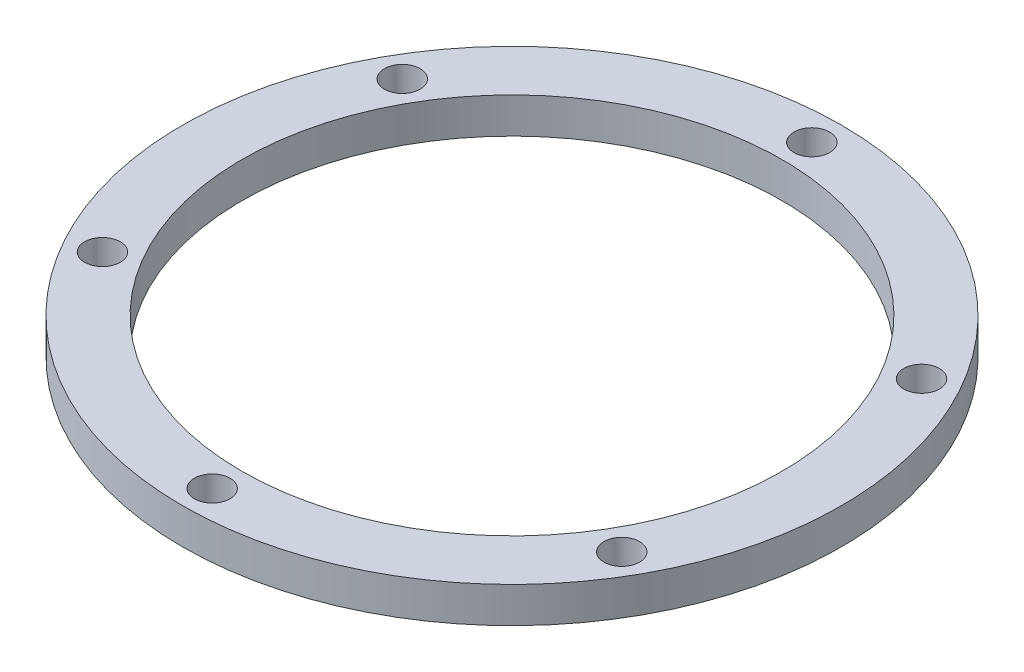
ISO-10303-21;
HEADER;
FILE_DESCRIPTION(('STEP AP214'),'2;1');
FILE_NAME('part.step','',(''),(''),'','','');
FILE_SCHEMA(('AUTOMOTIVE_DESIGN { 1 0 10303 214 1 1 1 1 }'));
ENDSEC;
DATA;
#1=APPLICATION_CONTEXT('core data for automotive mechanical design processes');
#2=APPLICATION_PROTOCOL_DEFINITION('international standard','automotive_design',2000,#1);
#3=PRODUCT_CONTEXT('',#1,'mechanical');
#4=PRODUCT('Part','Part','',(#3));
#5=PRODUCT_RELATED_PRODUCT_CATEGORY('part','',(#4));
#6=PRODUCT_DEFINITION_FORMATION('','',#4);
#7=PRODUCT_DEFINITION_CONTEXT('part definition',#1,'design');
#8=PRODUCT_DEFINITION('design','',#6,#7);
#9=PRODUCT_DEFINITION_SHAPE('','',#8);
#10=(LENGTH_UNIT() NAMED_UNIT(*) SI_UNIT(.MILLI.,.METRE.));
#11=(NAMED_UNIT(*) PLANE_ANGLE_UNIT() SI_UNIT($,.RADIAN.));
#12=(NAMED_UNIT(*) SI_UNIT($,.STERADIAN.) SOLID_ANGLE_UNIT());
#13=UNCERTAINTY_MEASURE_WITH_UNIT(LENGTH_MEASURE(1.E-05),#10,'distance_accuracy_value','');
#14=(GEOMETRIC_REPRESENTATION_CONTEXT(3) GLOBAL_UNCERTAINTY_ASSIGNED_CONTEXT((#13)) GLOBAL_UNIT_ASSIGNED_CONTEXT((#10,
#11,#12)) REPRESENTATION_CONTEXT('',''));
#15=CARTESIAN_POINT('',(0.,0.,0.));
#16=DIRECTION('',(0.,0.,1.));
#17=DIRECTION('',(1.,0.,0.));
#18=AXIS2_PLACEMENT_3D('',#15,#16,#17);
#19=CARTESIAN_POINT('',(0.,3.,0.));
#20=DIRECTION('',(0.,1.,0.));
#21=DIRECTION('',(0.,0.,1.));
#22=AXIS2_PLACEMENT_3D('',#19,#20,#21);
#23=PLANE('',#22);
#24=CARTESIAN_POINT('',(-21.8238401753679,3.,12.6));
#25=DIRECTION('',(0.,1.,0.));
#26=DIRECTION('',(0.,0.,1.));
#27=AXIS2_PLACEMENT_3D('',#24,#25,#26);
#28=CIRCLE('',#27,1.5);
#29=CARTESIAN_POINT('',(-21.8238401753679,3.,14.1));
#30=VERTEX_POINT('',#29);
#31=EDGE_CURVE('E80',#30,#30,#28,.T.);
#32=ORIENTED_EDGE('',*,*,#31,.F.);
#33=EDGE_LOOP('',(#32));
#34=FACE_BOUND('',#33,.T.);
#35=CARTESIAN_POINT('',(21.8238401753679,3.,12.6));
#36=DIRECTION('',(0.,1.,0.));
#37=DIRECTION('',(0.,0.,1.));
#38=AXIS2_PLACEMENT_3D('',#35,#36,#37);
#39=CIRCLE('',#38,1.5);
#40=CARTESIAN_POINT('',(21.8238401753679,3.,14.1));
#41=VERTEX_POINT('',#40);
#42=EDGE_CURVE('E63',#41,#41,#39,.T.);
#43=ORIENTED_EDGE('',*,*,#42,.F.);
#44=EDGE_LOOP('',(#43));
#45=FACE_BOUND('',#44,.T.);
#46=CARTESIAN_POINT('',(0.,3.,-25.2));
#47=DIRECTION('',(0.,1.,0.));
#48=DIRECTION('',(0.,0.,1.));
#49=AXIS2_PLACEMENT_3D('',#46,#47,#48);
#50=CIRCLE('',#49,1.5);
#51=CARTESIAN_POINT('',(0.,3.,-23.7));
#52=VERTEX_POINT('',#51);
#53=EDGE_CURVE('E52',#52,#52,#50,.T.);
#54=ORIENTED_EDGE('',*,*,#53,.F.);
#55=EDGE_LOOP('',(#54));
#56=FACE_BOUND('',#55,.T.);
#57=CARTESIAN_POINT('',(0.,3.,0.));
#58=DIRECTION('',(0.,1.,0.));
#59=DIRECTION('',(0.,0.,1.));
#60=AXIS2_PLACEMENT_3D('',#57,#58,#59);
#61=CIRCLE('',#60,27.7);
#62=CARTESIAN_POINT('',(0.,3.,27.7));
#63=VERTEX_POINT('',#62);
#64=EDGE_CURVE('E10',#63,#63,#61,.T.);
#65=ORIENTED_EDGE('',*,*,#64,.T.);
#66=EDGE_LOOP('',(#65));
#67=FACE_BOUND('',#66,.T.);
#68=CARTESIAN_POINT('',(0.,3.,0.));
#69=DIRECTION('',(0.,1.,0.));
#70=DIRECTION('',(0.,0.,1.));
#71=AXIS2_PLACEMENT_3D('',#68,#69,#70);
#72=CIRCLE('',#71,22.7);
#73=CARTESIAN_POINT('',(0.,3.,22.7));
#74=VERTEX_POINT('',#73);
#75=EDGE_CURVE('E48',#74,#74,#72,.T.);
#76=ORIENTED_EDGE('',*,*,#75,.F.);
#77=EDGE_LOOP('',(#76));
#78=FACE_BOUND('',#77,.T.);
#79=CARTESIAN_POINT('',(21.8238401753679,3.,-12.6));
#80=DIRECTION('',(0.,1.,0.));
#81=DIRECTION('',(0.,0.,1.));
#82=AXIS2_PLACEMENT_3D('',#79,#80,#81);
#83=CIRCLE('',#82,1.5);
#84=CARTESIAN_POINT('',(21.8238401753679,3.,-11.1));
#85=VERTEX_POINT('',#84);
#86=EDGE_CURVE('E56',#85,#85,#83,.T.);
#87=ORIENTED_EDGE('',*,*,#86,.F.);
#88=EDGE_LOOP('',(#87));
#89=FACE_BOUND('',#88,.T.);
#90=CARTESIAN_POINT('',(0.,3.,25.2));
#91=DIRECTION('',(0.,1.,0.));
#92=DIRECTION('',(0.,0.,1.));
#93=AXIS2_PLACEMENT_3D('',#90,#91,#92);
#94=CIRCLE('',#93,1.5);
#95=CARTESIAN_POINT('',(0.,3.,26.7));
#96=VERTEX_POINT('',#95);
#97=EDGE_CURVE('E72',#96,#96,#94,.T.);
#98=ORIENTED_EDGE('',*,*,#97,.F.);
#99=EDGE_LOOP('',(#98));
#100=FACE_BOUND('',#99,.T.);
#101=CARTESIAN_POINT('',(-21.8238401753679,3.,-12.6));
#102=DIRECTION('',(0.,1.,0.));
#103=DIRECTION('',(0.,0.,1.));
#104=AXIS2_PLACEMENT_3D('',#101,#102,#103);
#105=CIRCLE('',#104,1.5);
#106=CARTESIAN_POINT('',(-21.8238401753679,3.,-11.1));
#107=VERTEX_POINT('',#106);
#108=EDGE_CURVE('E84',#107,#107,#105,.T.);
#109=ORIENTED_EDGE('',*,*,#108,.F.);
#110=EDGE_LOOP('',(#109));
#111=FACE_BOUND('',#110,.T.);
#112=ADVANCED_FACE('F40',(#34,#45,#56,#67,#78,#89,#100,#111),#23,.T.);
#113=CARTESIAN_POINT('',(0.,0.,0.));
#114=DIRECTION('',(0.,1.,0.));
#115=DIRECTION('',(0.,0.,1.));
#116=AXIS2_PLACEMENT_3D('',#113,#114,#115);
#117=PLANE('',#116);
#118=CARTESIAN_POINT('',(0.,0.,0.));
#119=DIRECTION('',(0.,1.,0.));
#120=DIRECTION('',(0.,0.,1.));
#121=AXIS2_PLACEMENT_3D('',#118,#119,#120);
#122=CIRCLE('',#121,27.7);
#123=CARTESIAN_POINT('',(0.,0.,27.7));
#124=VERTEX_POINT('',#123);
#125=EDGE_CURVE('E41',#124,#124,#122,.T.);
#126=ORIENTED_EDGE('',*,*,#125,.F.);
#127=EDGE_LOOP('',(#126));
#128=FACE_BOUND('',#127,.T.);
#129=CARTESIAN_POINT('',(0.,0.,0.));
#130=DIRECTION('',(0.,1.,0.));
#131=DIRECTION('',(0.,0.,1.));
#132=AXIS2_PLACEMENT_3D('',#129,#130,#131);
#133=CIRCLE('',#132,22.7);
#134=CARTESIAN_POINT('',(0.,0.,22.7));
#135=VERTEX_POINT('',#134);
#136=EDGE_CURVE('E49',#135,#135,#133,.T.);
#137=ORIENTED_EDGE('',*,*,#136,.T.);
#138=EDGE_LOOP('',(#137));
#139=FACE_BOUND('',#138,.T.);
#140=CARTESIAN_POINT('',(0.,0.,-25.2));
#141=DIRECTION('',(0.,1.,0.));
#142=DIRECTION('',(0.,0.,1.));
#143=AXIS2_PLACEMENT_3D('',#140,#141,#142);
#144=CIRCLE('',#143,1.5);
#145=CARTESIAN_POINT('',(0.,0.,-23.7));
#146=VERTEX_POINT('',#145);
#147=EDGE_CURVE('E57',#146,#146,#144,.T.);
#148=ORIENTED_EDGE('',*,*,#147,.T.);
#149=EDGE_LOOP('',(#148));
#150=FACE_BOUND('',#149,.T.);
#151=CARTESIAN_POINT('',(21.8238401753679,0.,-12.6));
#152=DIRECTION('',(0.,1.,0.));
#153=DIRECTION('',(0.,0.,1.));
#154=AXIS2_PLACEMENT_3D('',#151,#152,#153);
#155=CIRCLE('',#154,1.5);
#156=CARTESIAN_POINT('',(21.8238401753679,0.,-11.1));
#157=VERTEX_POINT('',#156);
#158=EDGE_CURVE('E65',#157,#157,#155,.T.);
#159=ORIENTED_EDGE('',*,*,#158,.T.);
#160=EDGE_LOOP('',(#159));
#161=FACE_BOUND('',#160,.T.);
#162=CARTESIAN_POINT('',(21.8238401753679,0.,12.6));
#163=DIRECTION('',(0.,1.,0.));
#164=DIRECTION('',(0.,0.,1.));
#165=AXIS2_PLACEMENT_3D('',#162,#163,#164);
#166=CIRCLE('',#165,1.5);
#167=CARTESIAN_POINT('',(21.8238401753679,0.,14.1));
#168=VERTEX_POINT('',#167);
#169=EDGE_CURVE('E69',#168,#168,#166,.T.);
#170=ORIENTED_EDGE('',*,*,#169,.T.);
#171=EDGE_LOOP('',(#170));
#172=FACE_BOUND('',#171,.T.);
#173=CARTESIAN_POINT('',(0.,0.,25.2));
#174=DIRECTION('',(0.,1.,0.));
#175=DIRECTION('',(0.,0.,1.));
#176=AXIS2_PLACEMENT_3D('',#173,#174,#175);
#177=CIRCLE('',#176,1.5);
#178=CARTESIAN_POINT('',(0.,0.,26.7));
#179=VERTEX_POINT('',#178);
#180=EDGE_CURVE('E74',#179,#179,#177,.T.);
#181=ORIENTED_EDGE('',*,*,#180,.T.);
#182=EDGE_LOOP('',(#181));
#183=FACE_BOUND('',#182,.T.);
#184=CARTESIAN_POINT('',(-21.8238401753679,0.,12.6));
#185=DIRECTION('',(0.,1.,0.));
#186=DIRECTION('',(0.,0.,1.));
#187=AXIS2_PLACEMENT_3D('',#184,#185,#186);
#188=CIRCLE('',#187,1.5);
#189=CARTESIAN_POINT('',(-21.8238401753679,0.,14.1));
#190=VERTEX_POINT('',#189);
#191=EDGE_CURVE('E78',#190,#190,#188,.T.);
#192=ORIENTED_EDGE('',*,*,#191,.T.);
#193=EDGE_LOOP('',(#192));
#194=FACE_BOUND('',#193,.T.);
#195=CARTESIAN_POINT('',(-21.8238401753679,0.,-12.6));
#196=DIRECTION('',(0.,1.,0.));
#197=DIRECTION('',(0.,0.,1.));
#198=AXIS2_PLACEMENT_3D('',#195,#196,#197);
#199=CIRCLE('',#198,1.5);
#200=CARTESIAN_POINT('',(-21.8238401753679,0.,-11.1));
#201=VERTEX_POINT('',#200);
#202=EDGE_CURVE('E88',#201,#201,#199,.T.);
#203=ORIENTED_EDGE('',*,*,#202,.T.);
#204=EDGE_LOOP('',(#203));
#205=FACE_BOUND('',#204,.T.);
#206=ADVANCED_FACE('F96',(#128,#139,#150,#161,#172,#183,#194,#205),#117,.F.);
#207=CARTESIAN_POINT('',(0.,3.,0.));
#208=DIRECTION('',(0.,-1.,0.));
#209=DIRECTION('',(0.,0.,-1.));
#210=AXIS2_PLACEMENT_3D('',#207,#208,#209);
#211=CYLINDRICAL_SURFACE('',#210,27.7);
#212=ORIENTED_EDGE('',*,*,#64,.F.);
#213=EDGE_LOOP('',(#212));
#214=FACE_BOUND('',#213,.T.);
#215=ORIENTED_EDGE('',*,*,#125,.T.);
#216=EDGE_LOOP('',(#215));
#217=FACE_BOUND('',#216,.T.);
#218=ADVANCED_FACE('F39',(#214,#217),#211,.T.);
#219=CARTESIAN_POINT('',(0.,3.,0.));
#220=DIRECTION('',(0.,-1.,0.));
#221=DIRECTION('',(0.,0.,-1.));
#222=AXIS2_PLACEMENT_3D('',#219,#220,#221);
#223=CYLINDRICAL_SURFACE('',#222,22.7);
#224=ORIENTED_EDGE('',*,*,#75,.T.);
#225=EDGE_LOOP('',(#224));
#226=FACE_BOUND('',#225,.T.);
#227=ORIENTED_EDGE('',*,*,#136,.F.);
#228=EDGE_LOOP('',(#227));
#229=FACE_BOUND('',#228,.T.);
#230=ADVANCED_FACE('F106',(#226,#229),#223,.F.);
#231=CARTESIAN_POINT('',(0.,3.,-25.2));
#232=DIRECTION('',(0.,-1.,0.));
#233=DIRECTION('',(0.,0.,-1.));
#234=AXIS2_PLACEMENT_3D('',#231,#232,#233);
#235=CYLINDRICAL_SURFACE('',#234,1.5);
#236=ORIENTED_EDGE('',*,*,#53,.T.);
#237=EDGE_LOOP('',(#236));
#238=FACE_BOUND('',#237,.T.);
#239=ORIENTED_EDGE('',*,*,#147,.F.);
#240=EDGE_LOOP('',(#239));
#241=FACE_BOUND('',#240,.T.);
#242=ADVANCED_FACE('F108',(#238,#241),#235,.F.);
#243=CARTESIAN_POINT('',(21.8238401753679,3.,-12.6));
#244=DIRECTION('',(0.,-1.,0.));
#245=DIRECTION('',(0.,0.,-1.));
#246=AXIS2_PLACEMENT_3D('',#243,#244,#245);
#247=CYLINDRICAL_SURFACE('',#246,1.5);
#248=ORIENTED_EDGE('',*,*,#86,.T.);
#249=EDGE_LOOP('',(#248));
#250=FACE_BOUND('',#249,.T.);
#251=ORIENTED_EDGE('',*,*,#158,.F.);
#252=EDGE_LOOP('',(#251));
#253=FACE_BOUND('',#252,.T.);
#254=ADVANCED_FACE('F114',(#250,#253),#247,.F.);
#255=CARTESIAN_POINT('',(21.8238401753679,3.,12.6));
#256=DIRECTION('',(0.,-1.,0.));
#257=DIRECTION('',(0.,0.,-1.));
#258=AXIS2_PLACEMENT_3D('',#255,#256,#257);
#259=CYLINDRICAL_SURFACE('',#258,1.5);
#260=ORIENTED_EDGE('',*,*,#42,.T.);
#261=EDGE_LOOP('',(#260));
#262=FACE_BOUND('',#261,.T.);
#263=ORIENTED_EDGE('',*,*,#169,.F.);
#264=EDGE_LOOP('',(#263));
#265=FACE_BOUND('',#264,.T.);
#266=ADVANCED_FACE('F120',(#262,#265),#259,.F.);
#267=CARTESIAN_POINT('',(0.,3.,25.2));
#268=DIRECTION('',(0.,-1.,0.));
#269=DIRECTION('',(0.,0.,-1.));
#270=AXIS2_PLACEMENT_3D('',#267,#268,#269);
#271=CYLINDRICAL_SURFACE('',#270,1.5);
#272=ORIENTED_EDGE('',*,*,#97,.T.);
#273=EDGE_LOOP('',(#272));
#274=FACE_BOUND('',#273,.T.);
#275=ORIENTED_EDGE('',*,*,#180,.F.);
#276=EDGE_LOOP('',(#275));
#277=FACE_BOUND('',#276,.T.);
#278=ADVANCED_FACE('F122',(#274,#277),#271,.F.);
#279=CARTESIAN_POINT('',(-21.8238401753679,3.,12.6));
#280=DIRECTION('',(0.,-1.,0.));
#281=DIRECTION('',(0.,0.,-1.));
#282=AXIS2_PLACEMENT_3D('',#279,#280,#281);
#283=CYLINDRICAL_SURFACE('',#282,1.5);
#284=ORIENTED_EDGE('',*,*,#31,.T.);
#285=EDGE_LOOP('',(#284));
#286=FACE_BOUND('',#285,.T.);
#287=ORIENTED_EDGE('',*,*,#191,.F.);
#288=EDGE_LOOP('',(#287));
#289=FACE_BOUND('',#288,.T.);
#290=ADVANCED_FACE('F123',(#286,#289),#283,.F.);
#291=CARTESIAN_POINT('',(-21.8238401753679,3.,-12.6));
#292=DIRECTION('',(0.,-1.,0.));
#293=DIRECTION('',(0.,0.,-1.));
#294=AXIS2_PLACEMENT_3D('',#291,#292,#293);
#295=CYLINDRICAL_SURFACE('',#294,1.5);
#296=ORIENTED_EDGE('',*,*,#108,.T.);
#297=EDGE_LOOP('',(#296));
#298=FACE_BOUND('',#297,.T.);
#299=ORIENTED_EDGE('',*,*,#202,.F.);
#300=EDGE_LOOP('',(#299));
#301=FACE_BOUND('',#300,.T.);
#302=ADVANCED_FACE('F95',(#298,#301),#295,.F.);
#303=CLOSED_SHELL('',(#112,#206,#218,#230,#242,#254,#266,#278,#290,#302));
#304=MANIFOLD_SOLID_BREP('B2',#303);
#305=ADVANCED_BREP_SHAPE_REPRESENTATION('',(#18,#304),#14);
#306=SHAPE_DEFINITION_REPRESENTATION(#9,#305);
ENDSEC;
END-ISO-10303-21;
